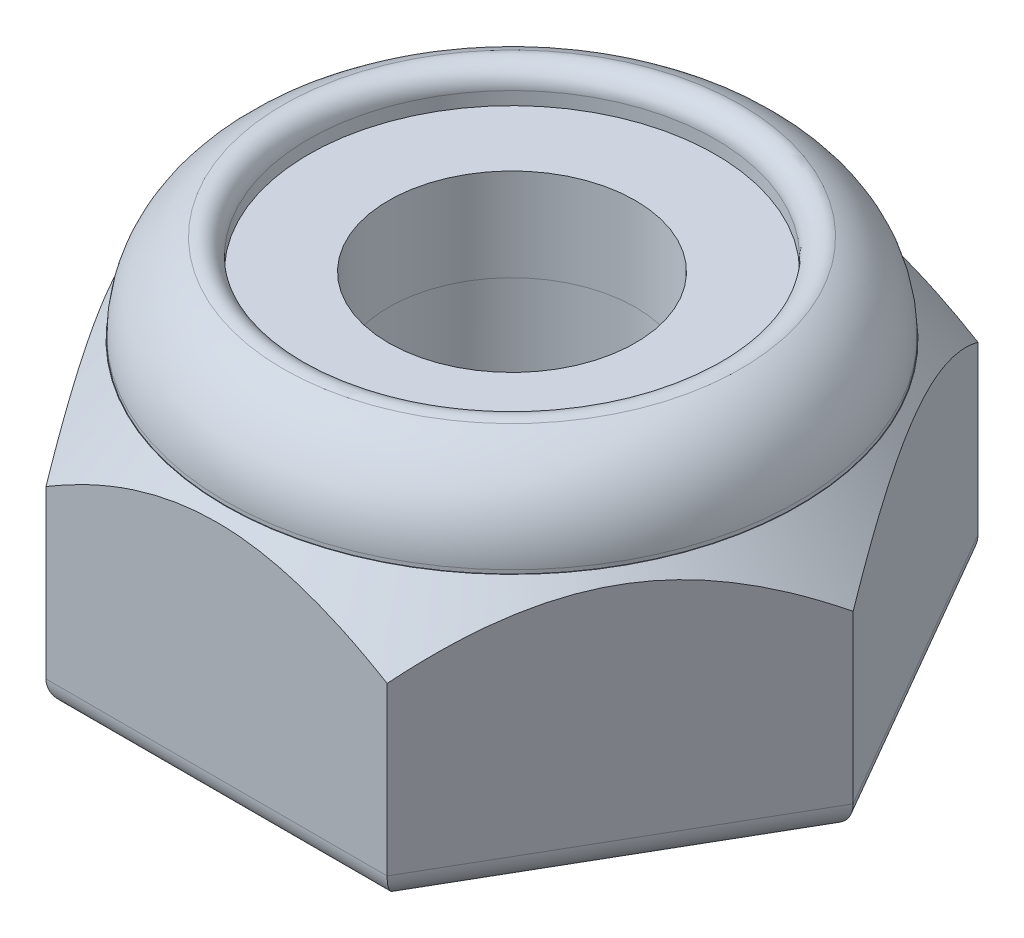
ISO-10303-21;
HEADER;
FILE_DESCRIPTION(('STEP AP214'),'2;1');
FILE_NAME('part.step','',(''),(''),'','','');
FILE_SCHEMA(('AUTOMOTIVE_DESIGN { 1 0 10303 214 1 1 1 1 }'));
ENDSEC;
DATA;
#1=APPLICATION_CONTEXT('core data for automotive mechanical design processes');
#2=APPLICATION_PROTOCOL_DEFINITION('international standard','automotive_design',2000,#1);
#3=PRODUCT_CONTEXT('',#1,'mechanical');
#4=PRODUCT('Part','Part','',(#3));
#5=PRODUCT_RELATED_PRODUCT_CATEGORY('part','',(#4));
#6=PRODUCT_DEFINITION_FORMATION('','',#4);
#7=PRODUCT_DEFINITION_CONTEXT('part definition',#1,'design');
#8=PRODUCT_DEFINITION('design','',#6,#7);
#9=PRODUCT_DEFINITION_SHAPE('','',#8);
#10=(LENGTH_UNIT() NAMED_UNIT(*) SI_UNIT(.MILLI.,.METRE.));
#11=(NAMED_UNIT(*) PLANE_ANGLE_UNIT() SI_UNIT($,.RADIAN.));
#12=(NAMED_UNIT(*) SI_UNIT($,.STERADIAN.) SOLID_ANGLE_UNIT());
#13=UNCERTAINTY_MEASURE_WITH_UNIT(LENGTH_MEASURE(1.E-05),#10,'distance_accuracy_value','');
#14=(GEOMETRIC_REPRESENTATION_CONTEXT(3) GLOBAL_UNCERTAINTY_ASSIGNED_CONTEXT((#13)) GLOBAL_UNIT_ASSIGNED_CONTEXT((#10,
#11,#12)) REPRESENTATION_CONTEXT('',''));
#15=CARTESIAN_POINT('',(0.,0.,0.));
#16=DIRECTION('',(0.,0.,1.));
#17=DIRECTION('',(1.,0.,0.));
#18=AXIS2_PLACEMENT_3D('',#15,#16,#17);
#19=CARTESIAN_POINT('',(0.,4.65025720786115,0.));
#20=DIRECTION('',(0.,-1.,0.));
#21=DIRECTION('',(0.,0.,-1.));
#22=AXIS2_PLACEMENT_3D('',#19,#20,#21);
#23=TOROIDAL_SURFACE('',#22,3.048,0.254);
#24=CARTESIAN_POINT('',(0.,4.65025720786115,0.));
#25=DIRECTION('',(0.,1.,0.));
#26=DIRECTION('',(0.,0.,-1.));
#27=AXIS2_PLACEMENT_3D('',#24,#25,#26);
#28=CIRCLE('',#27,2.794);
#29=CARTESIAN_POINT('',(0.,4.65025720786115,2.794));
#30=VERTEX_POINT('',#29);
#31=EDGE_CURVE('E23',#30,#30,#28,.T.);
#32=ORIENTED_EDGE('',*,*,#31,.F.);
#33=EDGE_LOOP('',(#32));
#34=FACE_BOUND('',#33,.T.);
#35=CARTESIAN_POINT('',(0.,4.88572150982643,0.));
#36=DIRECTION('',(0.,-1.,0.));
#37=DIRECTION('',(0.,0.,-1.));
#38=AXIS2_PLACEMENT_3D('',#35,#36,#37);
#39=CIRCLE('',#38,3.14325);
#40=CARTESIAN_POINT('',(0.,4.88572150982643,3.14325));
#41=VERTEX_POINT('',#40);
#42=EDGE_CURVE('E10',#41,#41,#39,.T.);
#43=ORIENTED_EDGE('',*,*,#42,.F.);
#44=EDGE_LOOP('',(#43));
#45=FACE_BOUND('',#44,.T.);
#46=ADVANCED_FACE('F16',(#34,#45),#23,.T.);
#47=CARTESIAN_POINT('',(0.,3.7084,0.));
#48=DIRECTION('',(0.,1.,0.));
#49=DIRECTION('',(0.,0.,1.));
#50=AXIS2_PLACEMENT_3D('',#47,#48,#49);
#51=TOROIDAL_SURFACE('',#50,2.667,1.27);
#52=CARTESIAN_POINT('',(0.,3.7084,0.));
#53=DIRECTION('',(0.,-1.,0.));
#54=DIRECTION('',(0.,0.,1.));
#55=AXIS2_PLACEMENT_3D('',#52,#53,#54);
#56=CIRCLE('',#55,3.937);
#57=CARTESIAN_POINT('',(0.,3.7084,-3.937));
#58=VERTEX_POINT('',#57);
#59=EDGE_CURVE('E267',#58,#58,#56,.T.);
#60=ORIENTED_EDGE('',*,*,#59,.F.);
#61=EDGE_LOOP('',(#60));
#62=FACE_BOUND('',#61,.T.);
#63=ORIENTED_EDGE('',*,*,#42,.T.);
#64=EDGE_LOOP('',(#63));
#65=FACE_BOUND('',#64,.T.);
#66=ADVANCED_FACE('F273',(#62,#65),#51,.T.);
#67=CARTESIAN_POINT('',(0.,4.4704,0.));
#68=DIRECTION('',(0.,-1.,0.));
#69=DIRECTION('',(0.,0.,1.));
#70=AXIS2_PLACEMENT_3D('',#67,#68,#69);
#71=CYLINDRICAL_SURFACE('',#70,2.794);
#72=ORIENTED_EDGE('',*,*,#31,.T.);
#73=EDGE_LOOP('',(#72));
#74=FACE_BOUND('',#73,.T.);
#75=CARTESIAN_POINT('',(0.,4.4704,0.));
#76=DIRECTION('',(0.,1.,0.));
#77=DIRECTION('',(0.,0.,1.));
#78=AXIS2_PLACEMENT_3D('',#75,#76,#77);
#79=CIRCLE('',#78,2.794);
#80=CARTESIAN_POINT('',(0.,4.4704,2.794));
#81=VERTEX_POINT('',#80);
#82=EDGE_CURVE('E183',#81,#81,#79,.T.);
#83=ORIENTED_EDGE('',*,*,#82,.F.);
#84=EDGE_LOOP('',(#83));
#85=FACE_BOUND('',#84,.T.);
#86=ADVANCED_FACE('F275',(#74,#85),#71,.F.);
#87=CARTESIAN_POINT('',(0.,4.9784,0.));
#88=DIRECTION('',(0.,1.,0.));
#89=DIRECTION('',(0.,0.,-1.));
#90=AXIS2_PLACEMENT_3D('',#87,#88,#89);
#91=CYLINDRICAL_SURFACE('',#90,3.937);
#92=ORIENTED_EDGE('',*,*,#59,.T.);
#93=EDGE_LOOP('',(#92));
#94=FACE_BOUND('',#93,.T.);
#95=CARTESIAN_POINT('',(0.,3.6576,0.));
#96=DIRECTION('',(0.,1.,0.));
#97=DIRECTION('',(0.,0.,-1.));
#98=AXIS2_PLACEMENT_3D('',#95,#96,#97);
#99=CIRCLE('',#98,3.937);
#100=CARTESIAN_POINT('',(0.,3.6576,-3.937));
#101=VERTEX_POINT('',#100);
#102=EDGE_CURVE('E181',#101,#101,#99,.T.);
#103=ORIENTED_EDGE('',*,*,#102,.T.);
#104=EDGE_LOOP('',(#103));
#105=FACE_BOUND('',#104,.T.);
#106=ADVANCED_FACE('F270',(#94,#105),#91,.T.);
#107=CARTESIAN_POINT('',(2.34315,3.6576,4.05845484975502));
#108=DIRECTION('',(-0.866025403784439,0.,-0.5));
#109=DIRECTION('',(-0.5,0.,0.866025403784439));
#110=AXIS2_PLACEMENT_3D('',#107,#108,#109);
#111=PLANE('',#110);
#112=DIRECTION('',(-0.5,0.,0.866025403784439));
#113=VECTOR('',#112,1.);
#114=CARTESIAN_POINT('',(2.9289375,0.4826,3.04384113731626));
#115=LINE('',#114,#113);
#116=CARTESIAN_POINT('',(4.6863,0.4826,0.));
#117=VERTEX_POINT('',#116);
#118=CARTESIAN_POINT('',(2.34315,0.4826,4.05845484975502));
#119=VERTEX_POINT('',#118);
#120=EDGE_CURVE('E150',#117,#119,#115,.T.);
#121=ORIENTED_EDGE('',*,*,#120,.F.);
#122=DIRECTION('',(0.,-1.,0.));
#123=VECTOR('',#122,1.);
#124=CARTESIAN_POINT('',(4.6863,0.508,0.));
#125=LINE('',#124,#123);
#126=CARTESIAN_POINT('',(4.6863,2.77304593389833,0.));
#127=VERTEX_POINT('',#126);
#128=EDGE_CURVE('E142',#127,#117,#125,.T.);
#129=ORIENTED_EDGE('',*,*,#128,.F.);
#130=CARTESIAN_POINT('',(6.62416236823912,-0.492,-3.35647607986592));
#131=CARTESIAN_POINT('',(3.514725,5.71462077953579,2.02922742487751));
#132=CARTESIAN_POINT('',(0.40528763176088,-0.492,7.41493092962093));
#133=(BOUNDED_CURVE() B_SPLINE_CURVE(2,(#130,#131,#132),.UNSPECIFIED.,.F.,
.F.) B_SPLINE_CURVE_WITH_KNOTS((3,3),(0.,1.4802816028728),
.UNSPECIFIED.) CURVE() GEOMETRIC_REPRESENTATION_ITEM() RATIONAL_B_SPLINE_CURVE((1.,
1.82976012148053,1.)) REPRESENTATION_ITEM(''));
#134=CARTESIAN_POINT('',(2.34315,2.77304593389833,4.05845484975502));
#135=VERTEX_POINT('',#134);
#136=EDGE_CURVE('E243',#127,#135,#133,.T.);
#137=ORIENTED_EDGE('',*,*,#136,.T.);
#138=DIRECTION('',(0.,-1.,0.));
#139=VECTOR('',#138,1.);
#140=CARTESIAN_POINT('',(2.34315,2.77304593389833,4.05845484975502));
#141=LINE('',#140,#139);
#142=EDGE_CURVE('E263',#135,#119,#141,.T.);
#143=ORIENTED_EDGE('',*,*,#142,.T.);
#144=EDGE_LOOP('',(#121,#129,#137,#143));
#145=FACE_BOUND('',#144,.T.);
#146=ADVANCED_FACE('F286',(#145),#111,.F.);
#147=CARTESIAN_POINT('',(0.,4.4704,0.));
#148=DIRECTION('',(0.,1.,0.));
#149=DIRECTION('',(0.,0.,1.));
#150=AXIS2_PLACEMENT_3D('',#147,#148,#149);
#151=PLANE('',#150);
#152=CARTESIAN_POINT('',(0.,4.4704,0.));
#153=DIRECTION('',(0.,-1.,0.));
#154=DIRECTION('',(0.,0.,1.));
#155=AXIS2_PLACEMENT_3D('',#152,#153,#154);
#156=CIRCLE('',#155,1.69545);
#157=CARTESIAN_POINT('',(0.,4.4704,1.69545));
#158=VERTEX_POINT('',#157);
#159=EDGE_CURVE('E227',#158,#158,#156,.T.);
#160=ORIENTED_EDGE('',*,*,#159,.T.);
#161=EDGE_LOOP('',(#160));
#162=FACE_BOUND('',#161,.T.);
#163=ORIENTED_EDGE('',*,*,#82,.T.);
#164=EDGE_LOOP('',(#163));
#165=FACE_BOUND('',#164,.T.);
#166=ADVANCED_FACE('F289',(#162,#165),#151,.T.);
#167=CARTESIAN_POINT('',(2.34315,3.6576,4.05845484975502));
#168=DIRECTION('',(0.,-1.,0.));
#169=DIRECTION('',(0.,0.,-1.));
#170=AXIS2_PLACEMENT_3D('',#167,#168,#169);
#171=PLANE('',#170);
#172=ORIENTED_EDGE('',*,*,#102,.F.);
#173=EDGE_LOOP('',(#172));
#174=FACE_BOUND('',#173,.T.);
#175=CARTESIAN_POINT('',(0.,3.6576,0.));
#176=DIRECTION('',(0.,1.,0.));
#177=DIRECTION('',(0.,0.,1.));
#178=AXIS2_PLACEMENT_3D('',#175,#176,#177);
#179=CIRCLE('',#178,3.94407100937772);
#180=CARTESIAN_POINT('',(0.,3.6576,-3.94407100937772));
#181=VERTEX_POINT('',#180);
#182=EDGE_CURVE('E258',#181,#181,#179,.T.);
#183=ORIENTED_EDGE('',*,*,#182,.T.);
#184=EDGE_LOOP('',(#183));
#185=FACE_BOUND('',#184,.T.);
#186=ADVANCED_FACE('F293',(#174,#185),#171,.F.);
#187=CARTESIAN_POINT('',(4.6863,3.6576,0.));
#188=DIRECTION('',(-0.866025403784439,0.,0.5));
#189=DIRECTION('',(0.5,0.,0.866025403784439));
#190=AXIS2_PLACEMENT_3D('',#187,#188,#189);
#191=PLANE('',#190);
#192=DIRECTION('',(0.5,0.,0.866025403784439));
#193=VECTOR('',#192,1.);
#194=CARTESIAN_POINT('',(4.1005125,0.4826,-1.01461371243876));
#195=LINE('',#194,#193);
#196=CARTESIAN_POINT('',(2.34315,0.4826,-4.05845484975502));
#197=VERTEX_POINT('',#196);
#198=EDGE_CURVE('E138',#197,#117,#195,.T.);
#199=ORIENTED_EDGE('',*,*,#198,.F.);
#200=DIRECTION('',(0.,-1.,0.));
#201=VECTOR('',#200,1.);
#202=CARTESIAN_POINT('',(2.34315,0.508,-4.05845484975502));
#203=LINE('',#202,#201);
#204=CARTESIAN_POINT('',(2.34315,2.77304593389832,-4.05845484975502));
#205=VERTEX_POINT('',#204);
#206=EDGE_CURVE('E115',#205,#197,#203,.T.);
#207=ORIENTED_EDGE('',*,*,#206,.F.);
#208=CARTESIAN_POINT('',(0.405287631760878,-0.492,-7.41493092962093));
#209=CARTESIAN_POINT('',(3.514725,5.7146207795358,-2.02922742487751));
#210=CARTESIAN_POINT('',(6.62416236823912,-0.492,3.35647607986592));
#211=(BOUNDED_CURVE() B_SPLINE_CURVE(2,(#208,#209,#210),.UNSPECIFIED.,.F.,
.F.) B_SPLINE_CURVE_WITH_KNOTS((3,3),(0.,1.4802816028728),
.UNSPECIFIED.) CURVE() GEOMETRIC_REPRESENTATION_ITEM() RATIONAL_B_SPLINE_CURVE((1.,
1.82976012148053,1.)) REPRESENTATION_ITEM(''));
#212=EDGE_CURVE('E251',#205,#127,#211,.T.);
#213=ORIENTED_EDGE('',*,*,#212,.T.);
#214=ORIENTED_EDGE('',*,*,#128,.T.);
#215=EDGE_LOOP('',(#199,#207,#213,#214));
#216=FACE_BOUND('',#215,.T.);
#217=ADVANCED_FACE('F141',(#216),#191,.F.);
#218=CARTESIAN_POINT('',(-2.34315,3.6576,4.05845484975502));
#219=DIRECTION('',(0.,0.,-1.));
#220=DIRECTION('',(-1.,0.,0.));
#221=AXIS2_PLACEMENT_3D('',#218,#219,#220);
#222=PLANE('',#221);
#223=DIRECTION('',(-1.,0.,0.));
#224=VECTOR('',#223,1.);
#225=CARTESIAN_POINT('',(-1.171575,0.4826,4.05845484975502));
#226=LINE('',#225,#224);
#227=CARTESIAN_POINT('',(-2.34315,0.4826,4.05845484975502));
#228=VERTEX_POINT('',#227);
#229=EDGE_CURVE('E172',#119,#228,#226,.T.);
#230=ORIENTED_EDGE('',*,*,#229,.F.);
#231=ORIENTED_EDGE('',*,*,#142,.F.);
#232=CARTESIAN_POINT('',(6.21887473647825,-0.492,4.05845484975502));
#233=CARTESIAN_POINT('',(0.,5.71462077953579,4.05845484975501));
#234=CARTESIAN_POINT('',(-6.21887473647825,-0.492,4.05845484975502));
#235=(BOUNDED_CURVE() B_SPLINE_CURVE(2,(#232,#233,#234),.UNSPECIFIED.,.F.,
.F.) B_SPLINE_CURVE_WITH_KNOTS((3,3),(-1.4802816028728,0.),
.UNSPECIFIED.) CURVE() GEOMETRIC_REPRESENTATION_ITEM() RATIONAL_B_SPLINE_CURVE((1.,
1.82976012148054,1.)) REPRESENTATION_ITEM(''));
#236=CARTESIAN_POINT('',(0.,3.52128264729563,4.05845484975502));
#237=VERTEX_POINT('',#236);
#238=EDGE_CURVE('E236',#135,#237,#235,.T.);
#239=ORIENTED_EDGE('',*,*,#238,.T.);
#240=CARTESIAN_POINT('',(6.21887473647825,-0.492,4.05845484975502));
#241=CARTESIAN_POINT('',(0.,5.71462077953579,4.05845484975501));
#242=CARTESIAN_POINT('',(-6.21887473647825,-0.492,4.05845484975502));
#243=(BOUNDED_CURVE() B_SPLINE_CURVE(2,(#240,#241,#242),.UNSPECIFIED.,.F.,
.F.) B_SPLINE_CURVE_WITH_KNOTS((3,3),(0.,1.4802816028728),
.UNSPECIFIED.) CURVE() GEOMETRIC_REPRESENTATION_ITEM() RATIONAL_B_SPLINE_CURVE((1.,
1.82976012148054,1.)) REPRESENTATION_ITEM(''));
#244=CARTESIAN_POINT('',(-2.34315,2.77304593389833,4.05845484975502));
#245=VERTEX_POINT('',#244);
#246=EDGE_CURVE('E232',#237,#245,#243,.T.);
#247=ORIENTED_EDGE('',*,*,#246,.T.);
#248=DIRECTION('',(0.,-1.,0.));
#249=VECTOR('',#248,1.);
#250=CARTESIAN_POINT('',(-2.34315,2.77304593389833,4.05845484975502));
#251=LINE('',#250,#249);
#252=EDGE_CURVE('E212',#245,#228,#251,.T.);
#253=ORIENTED_EDGE('',*,*,#252,.T.);
#254=EDGE_LOOP('',(#230,#231,#239,#247,#253));
#255=FACE_BOUND('',#254,.T.);
#256=ADVANCED_FACE('F308',(#255),#222,.F.);
#257=CARTESIAN_POINT('',(0.,0.,0.));
#258=DIRECTION('',(0.,-1.,0.));
#259=DIRECTION('',(0.,0.,1.));
#260=AXIS2_PLACEMENT_3D('',#257,#258,#259);
#261=CYLINDRICAL_SURFACE('',#260,1.69545);
#262=CARTESIAN_POINT('',(0.,3.2004,0.));
#263=DIRECTION('',(0.,1.,0.));
#264=DIRECTION('',(0.,0.,1.));
#265=AXIS2_PLACEMENT_3D('',#262,#263,#264);
#266=CIRCLE('',#265,1.69545);
#267=CARTESIAN_POINT('',(0.,3.2004,-1.69545));
#268=VERTEX_POINT('',#267);
#269=EDGE_CURVE('E229',#268,#268,#266,.T.);
#270=ORIENTED_EDGE('',*,*,#269,.T.);
#271=EDGE_LOOP('',(#270));
#272=FACE_BOUND('',#271,.T.);
#273=CARTESIAN_POINT('',(0.,0.1016,0.));
#274=DIRECTION('',(0.,1.,0.));
#275=DIRECTION('',(-1.,0.,0.));
#276=AXIS2_PLACEMENT_3D('',#273,#274,#275);
#277=CIRCLE('',#276,1.69545);
#278=CARTESIAN_POINT('',(1.69545,0.1016,0.));
#279=VERTEX_POINT('',#278);
#280=EDGE_CURVE('E221',#279,#279,#277,.T.);
#281=ORIENTED_EDGE('',*,*,#280,.F.);
#282=EDGE_LOOP('',(#281));
#283=FACE_BOUND('',#282,.T.);
#284=ADVANCED_FACE('F299',(#272,#283),#261,.F.);
#285=CARTESIAN_POINT('',(0.,-21.9125804570201,0.));
#286=DIRECTION('',(0.,-1.,0.));
#287=DIRECTION('',(0.,0.,-1.));
#288=AXIS2_PLACEMENT_3D('',#285,#286,#287);
#289=CONICAL_SURFACE('',#288,25.4,0.698131700797737);
#290=ORIENTED_EDGE('',*,*,#182,.F.);
#291=EDGE_LOOP('',(#290));
#292=FACE_BOUND('',#291,.T.);
#293=CARTESIAN_POINT('',(-6.21887473647825,-0.492,-4.05845484975502));
#294=CARTESIAN_POINT('',(0.,5.71462077953579,-4.05845484975502));
#295=CARTESIAN_POINT('',(6.21887473647825,-0.492,-4.05845484975502));
#296=(BOUNDED_CURVE() B_SPLINE_CURVE(2,(#293,#294,#295),.UNSPECIFIED.,.F.,
.F.) B_SPLINE_CURVE_WITH_KNOTS((3,3),(-1.4802816028728,0.),
.UNSPECIFIED.) CURVE() GEOMETRIC_REPRESENTATION_ITEM() RATIONAL_B_SPLINE_CURVE((1.,
1.82976012148053,1.)) REPRESENTATION_ITEM(''));
#297=CARTESIAN_POINT('',(-2.34315,2.77304593389832,-4.05845484975502));
#298=VERTEX_POINT('',#297);
#299=CARTESIAN_POINT('',(0.,3.52128264729563,-4.05845484975502));
#300=VERTEX_POINT('',#299);
#301=EDGE_CURVE('E194',#298,#300,#296,.T.);
#302=ORIENTED_EDGE('',*,*,#301,.F.);
#303=CARTESIAN_POINT('',(-6.62416236823913,-0.492,3.35647607986591));
#304=CARTESIAN_POINT('',(-3.51472500000001,5.71462077953579,-2.02922742487752));
#305=CARTESIAN_POINT('',(-0.405287631760878,-0.492,-7.41493092962093));
#306=(BOUNDED_CURVE() B_SPLINE_CURVE(2,(#303,#304,#305),.UNSPECIFIED.,.F.,
.F.) B_SPLINE_CURVE_WITH_KNOTS((3,3),(-1.4802816028728,0.),
.UNSPECIFIED.) CURVE() GEOMETRIC_REPRESENTATION_ITEM() RATIONAL_B_SPLINE_CURVE((1.,
1.82976012148053,1.)) REPRESENTATION_ITEM(''));
#307=CARTESIAN_POINT('',(-4.6863,2.77304593389832,0.));
#308=VERTEX_POINT('',#307);
#309=EDGE_CURVE('E208',#308,#298,#306,.T.);
#310=ORIENTED_EDGE('',*,*,#309,.F.);
#311=CARTESIAN_POINT('',(-0.405287631760876,-0.492,7.41493092962093));
#312=CARTESIAN_POINT('',(-3.514725,5.71462077953578,2.0292274248775));
#313=CARTESIAN_POINT('',(-6.62416236823913,-0.492,-3.35647607986591));
#314=(BOUNDED_CURVE() B_SPLINE_CURVE(2,(#311,#312,#313),.UNSPECIFIED.,.F.,
.F.) B_SPLINE_CURVE_WITH_KNOTS((3,3),(-1.4802816028728,0.),
.UNSPECIFIED.) CURVE() GEOMETRIC_REPRESENTATION_ITEM() RATIONAL_B_SPLINE_CURVE((1.,
1.82976012148054,1.)) REPRESENTATION_ITEM(''));
#315=EDGE_CURVE('E217',#245,#308,#314,.T.);
#316=ORIENTED_EDGE('',*,*,#315,.F.);
#317=ORIENTED_EDGE('',*,*,#246,.F.);
#318=ORIENTED_EDGE('',*,*,#238,.F.);
#319=ORIENTED_EDGE('',*,*,#136,.F.);
#320=ORIENTED_EDGE('',*,*,#212,.F.);
#321=CARTESIAN_POINT('',(-6.21887473647825,-0.492,-4.05845484975502));
#322=CARTESIAN_POINT('',(0.,5.71462077953579,-4.05845484975502));
#323=CARTESIAN_POINT('',(6.21887473647825,-0.492,-4.05845484975502));
#324=(BOUNDED_CURVE() B_SPLINE_CURVE(2,(#321,#322,#323),.UNSPECIFIED.,.F.,
.F.) B_SPLINE_CURVE_WITH_KNOTS((3,3),(-1.4802816028728,0.),
.UNSPECIFIED.) CURVE() GEOMETRIC_REPRESENTATION_ITEM() RATIONAL_B_SPLINE_CURVE((1.,
1.82976012148053,1.)) REPRESENTATION_ITEM(''));
#325=EDGE_CURVE('E121',#300,#205,#324,.T.);
#326=ORIENTED_EDGE('',*,*,#325,.F.);
#327=EDGE_LOOP('',(#302,#310,#316,#317,#318,#319,#320,#326));
#328=FACE_BOUND('',#327,.T.);
#329=ADVANCED_FACE('F295',(#292,#328),#289,.T.);
#330=CARTESIAN_POINT('',(0.,0.,0.));
#331=DIRECTION('',(0.,-1.,0.));
#332=DIRECTION('',(0.,0.,1.));
#333=AXIS2_PLACEMENT_3D('',#330,#331,#332);
#334=CYLINDRICAL_SURFACE('',#333,1.69545);
#335=ORIENTED_EDGE('',*,*,#269,.F.);
#336=EDGE_LOOP('',(#335));
#337=FACE_BOUND('',#336,.T.);
#338=ORIENTED_EDGE('',*,*,#159,.F.);
#339=EDGE_LOOP('',(#338));
#340=FACE_BOUND('',#339,.T.);
#341=ADVANCED_FACE('F298',(#337,#340),#334,.F.);
#342=CARTESIAN_POINT('',(0.,0.1016,0.));
#343=DIRECTION('',(0.,-1.,0.));
#344=DIRECTION('',(0.,0.,-1.));
#345=AXIS2_PLACEMENT_3D('',#342,#343,#344);
#346=PLANE('',#345);
#347=DIRECTION('',(0.5,0.,0.866025403784439));
#348=VECTOR('',#347,1.);
#349=CARTESIAN_POINT('',(-3.77055682115813,0.1016,0.824113712438751));
#350=LINE('',#349,#348);
#351=CARTESIAN_POINT('',(-4.24635909487751,0.1016,0.));
#352=VERTEX_POINT('',#351);
#353=CARTESIAN_POINT('',(-2.12317954743876,0.1016,3.67745484975501));
#354=VERTEX_POINT('',#353);
#355=EDGE_CURVE('E153',#352,#354,#350,.T.);
#356=ORIENTED_EDGE('',*,*,#355,.F.);
#357=DIRECTION('',(-0.5,0.,0.866025403784439));
#358=VECTOR('',#357,1.);
#359=CARTESIAN_POINT('',(-2.59898182115813,0.1016,-2.85334113731627));
#360=LINE('',#359,#358);
#361=CARTESIAN_POINT('',(-2.12317954743876,0.1016,-3.67745484975502));
#362=VERTEX_POINT('',#361);
#363=EDGE_CURVE('E190',#362,#352,#360,.T.);
#364=ORIENTED_EDGE('',*,*,#363,.F.);
#365=DIRECTION('',(-1.,0.,0.));
#366=VECTOR('',#365,1.);
#367=CARTESIAN_POINT('',(1.171575,0.1016,-3.67745484975502));
#368=LINE('',#367,#366);
#369=CARTESIAN_POINT('',(2.12317954743876,0.1016,-3.67745484975502));
#370=VERTEX_POINT('',#369);
#371=EDGE_CURVE('E137',#370,#362,#368,.T.);
#372=ORIENTED_EDGE('',*,*,#371,.F.);
#373=DIRECTION('',(-0.5,0.,-0.866025403784439));
#374=VECTOR('',#373,1.);
#375=CARTESIAN_POINT('',(3.77055682115813,0.1016,-0.824113712438757));
#376=LINE('',#375,#374);
#377=CARTESIAN_POINT('',(4.2463590948775,0.1016,0.));
#378=VERTEX_POINT('',#377);
#379=EDGE_CURVE('E148',#378,#370,#376,.T.);
#380=ORIENTED_EDGE('',*,*,#379,.F.);
#381=DIRECTION('',(0.5,0.,-0.866025403784439));
#382=VECTOR('',#381,1.);
#383=CARTESIAN_POINT('',(2.59898182115813,0.1016,2.85334113731626));
#384=LINE('',#383,#382);
#385=CARTESIAN_POINT('',(2.12317954743876,0.1016,3.67745484975501));
#386=VERTEX_POINT('',#385);
#387=EDGE_CURVE('E175',#386,#378,#384,.T.);
#388=ORIENTED_EDGE('',*,*,#387,.F.);
#389=DIRECTION('',(1.,0.,0.));
#390=VECTOR('',#389,1.);
#391=CARTESIAN_POINT('',(-1.171575,0.1016,3.67745484975501));
#392=LINE('',#391,#390);
#393=EDGE_CURVE('E166',#354,#386,#392,.T.);
#394=ORIENTED_EDGE('',*,*,#393,.F.);
#395=EDGE_LOOP('',(#356,#364,#372,#380,#388,#394));
#396=FACE_BOUND('',#395,.T.);
#397=ORIENTED_EDGE('',*,*,#280,.T.);
#398=EDGE_LOOP('',(#397));
#399=FACE_BOUND('',#398,.T.);
#400=ADVANCED_FACE('F301',(#396,#399),#346,.T.);
#401=CARTESIAN_POINT('',(-4.6863,3.6576,0.));
#402=DIRECTION('',(0.866025403784439,0.,-0.5));
#403=DIRECTION('',(-0.5,0.,-0.866025403784439));
#404=AXIS2_PLACEMENT_3D('',#401,#402,#403);
#405=PLANE('',#404);
#406=DIRECTION('',(-0.5,0.,-0.866025403784439));
#407=VECTOR('',#406,1.);
#408=CARTESIAN_POINT('',(-4.10051250000001,0.4826,1.01461371243875));
#409=LINE('',#408,#407);
#410=CARTESIAN_POINT('',(-4.6863,0.4826,0.));
#411=VERTEX_POINT('',#410);
#412=EDGE_CURVE('E158',#228,#411,#409,.T.);
#413=ORIENTED_EDGE('',*,*,#412,.F.);
#414=ORIENTED_EDGE('',*,*,#252,.F.);
#415=ORIENTED_EDGE('',*,*,#315,.T.);
#416=DIRECTION('',(0.,-1.,0.));
#417=VECTOR('',#416,1.);
#418=CARTESIAN_POINT('',(-4.6863,2.77304593389832,0.));
#419=LINE('',#418,#417);
#420=EDGE_CURVE('E125',#308,#411,#419,.T.);
#421=ORIENTED_EDGE('',*,*,#420,.T.);
#422=EDGE_LOOP('',(#413,#414,#415,#421));
#423=FACE_BOUND('',#422,.T.);
#424=ADVANCED_FACE('F304',(#423),#405,.F.);
#425=CARTESIAN_POINT('',(-2.34315,3.6576,-4.05845484975502));
#426=DIRECTION('',(0.866025403784439,0.,0.5));
#427=DIRECTION('',(0.5,0.,-0.866025403784439));
#428=AXIS2_PLACEMENT_3D('',#425,#426,#427);
#429=PLANE('',#428);
#430=DIRECTION('',(0.5,0.,-0.866025403784439));
#431=VECTOR('',#430,1.);
#432=CARTESIAN_POINT('',(-2.92893750000001,0.4826,-3.04384113731627));
#433=LINE('',#432,#431);
#434=CARTESIAN_POINT('',(-2.34315,0.4826,-4.05845484975502));
#435=VERTEX_POINT('',#434);
#436=EDGE_CURVE('E187',#411,#435,#433,.T.);
#437=ORIENTED_EDGE('',*,*,#436,.F.);
#438=ORIENTED_EDGE('',*,*,#420,.F.);
#439=ORIENTED_EDGE('',*,*,#309,.T.);
#440=DIRECTION('',(0.,-1.,0.));
#441=VECTOR('',#440,1.);
#442=CARTESIAN_POINT('',(-2.34315,0.508,-4.05845484975502));
#443=LINE('',#442,#441);
#444=EDGE_CURVE('E192',#298,#435,#443,.T.);
#445=ORIENTED_EDGE('',*,*,#444,.T.);
#446=EDGE_LOOP('',(#437,#438,#439,#445));
#447=FACE_BOUND('',#446,.T.);
#448=ADVANCED_FACE('F311',(#447),#429,.F.);
#449=CARTESIAN_POINT('',(2.34315,3.6576,-4.05845484975502));
#450=DIRECTION('',(0.,0.,1.));
#451=DIRECTION('',(1.,0.,0.));
#452=AXIS2_PLACEMENT_3D('',#449,#450,#451);
#453=PLANE('',#452);
#454=DIRECTION('',(1.,0.,0.));
#455=VECTOR('',#454,1.);
#456=CARTESIAN_POINT('',(1.171575,0.4826,-4.05845484975502));
#457=LINE('',#456,#455);
#458=EDGE_CURVE('E119',#435,#197,#457,.T.);
#459=ORIENTED_EDGE('',*,*,#458,.F.);
#460=ORIENTED_EDGE('',*,*,#444,.F.);
#461=ORIENTED_EDGE('',*,*,#301,.T.);
#462=ORIENTED_EDGE('',*,*,#325,.T.);
#463=ORIENTED_EDGE('',*,*,#206,.T.);
#464=EDGE_LOOP('',(#459,#460,#461,#462,#463));
#465=FACE_BOUND('',#464,.T.);
#466=ADVANCED_FACE('F117',(#465),#453,.F.);
#467=CARTESIAN_POINT('',(-2.59898182115813,0.4826,-2.85334113731627));
#468=DIRECTION('',(-0.5,0.,0.866025403784439));
#469=DIRECTION('',(-0.612372435695795,-0.707106781186547,-0.353553390593274));
#470=AXIS2_PLACEMENT_3D('',#467,#468,#469);
#471=CYLINDRICAL_SURFACE('',#470,0.381);
#472=ORIENTED_EDGE('',*,*,#436,.T.);
#473=CARTESIAN_POINT('',(-2.12317954743876,0.4826,-3.67745484975502));
#474=DIRECTION('',(0.866025403784439,0.,-0.5));
#475=DIRECTION('',(-0.5,0.,-0.866025403784439));
#476=AXIS2_PLACEMENT_3D('',#473,#474,#475);
#477=ELLIPSE('',#476,0.439940905122495,0.381);
#478=EDGE_CURVE('E136',#362,#435,#477,.T.);
#479=ORIENTED_EDGE('',*,*,#478,.F.);
#480=ORIENTED_EDGE('',*,*,#363,.T.);
#481=CARTESIAN_POINT('',(-4.24635909487751,0.4826,0.));
#482=DIRECTION('',(0.,0.,-1.));
#483=DIRECTION('',(-1.,0.,0.));
#484=AXIS2_PLACEMENT_3D('',#481,#482,#483);
#485=ELLIPSE('',#484,0.439940905122495,0.381);
#486=EDGE_CURVE('E162',#352,#411,#485,.T.);
#487=ORIENTED_EDGE('',*,*,#486,.T.);
#488=EDGE_LOOP('',(#472,#479,#480,#487));
#489=FACE_BOUND('',#488,.T.);
#490=ADVANCED_FACE('F318',(#489),#471,.T.);
#491=CARTESIAN_POINT('',(1.171575,0.4826,-3.67745484975502));
#492=DIRECTION('',(-1.,0.,0.));
#493=DIRECTION('',(0.,-0.707106781186547,-0.707106781186548));
#494=AXIS2_PLACEMENT_3D('',#491,#492,#493);
#495=CYLINDRICAL_SURFACE('',#494,0.381);
#496=ORIENTED_EDGE('',*,*,#458,.T.);
#497=CARTESIAN_POINT('',(2.12317954743876,0.4826,-3.67745484975502));
#498=DIRECTION('',(0.866025403784439,0.,0.5));
#499=DIRECTION('',(0.5,0.,-0.866025403784439));
#500=AXIS2_PLACEMENT_3D('',#497,#498,#499);
#501=ELLIPSE('',#500,0.439940905122496,0.381);
#502=EDGE_CURVE('E133',#370,#197,#501,.T.);
#503=ORIENTED_EDGE('',*,*,#502,.F.);
#504=ORIENTED_EDGE('',*,*,#371,.T.);
#505=ORIENTED_EDGE('',*,*,#478,.T.);
#506=EDGE_LOOP('',(#496,#503,#504,#505));
#507=FACE_BOUND('',#506,.T.);
#508=ADVANCED_FACE('F130',(#507),#495,.T.);
#509=CARTESIAN_POINT('',(3.77055682115813,0.4826,-0.824113712438757));
#510=DIRECTION('',(-0.5,0.,-0.866025403784439));
#511=DIRECTION('',(0.612372435695795,-0.707106781186548,-0.353553390593274));
#512=AXIS2_PLACEMENT_3D('',#509,#510,#511);
#513=CYLINDRICAL_SURFACE('',#512,0.381);
#514=ORIENTED_EDGE('',*,*,#379,.T.);
#515=ORIENTED_EDGE('',*,*,#502,.T.);
#516=ORIENTED_EDGE('',*,*,#198,.T.);
#517=CARTESIAN_POINT('',(4.2463590948775,0.4826,0.));
#518=DIRECTION('',(0.,0.,1.));
#519=DIRECTION('',(1.,0.,0.));
#520=AXIS2_PLACEMENT_3D('',#517,#518,#519);
#521=ELLIPSE('',#520,0.439940905122495,0.381);
#522=EDGE_CURVE('E178',#378,#117,#521,.T.);
#523=ORIENTED_EDGE('',*,*,#522,.F.);
#524=EDGE_LOOP('',(#514,#515,#516,#523));
#525=FACE_BOUND('',#524,.T.);
#526=ADVANCED_FACE('F147',(#525),#513,.T.);
#527=CARTESIAN_POINT('',(2.59898182115813,0.4826,2.85334113731626));
#528=DIRECTION('',(0.5,0.,-0.866025403784439));
#529=DIRECTION('',(0.612372435695795,-0.707106781186548,0.353553390593274));
#530=AXIS2_PLACEMENT_3D('',#527,#528,#529);
#531=CYLINDRICAL_SURFACE('',#530,0.381);
#532=ORIENTED_EDGE('',*,*,#387,.T.);
#533=ORIENTED_EDGE('',*,*,#522,.T.);
#534=ORIENTED_EDGE('',*,*,#120,.T.);
#535=CARTESIAN_POINT('',(2.12317954743876,0.4826,3.67745484975501));
#536=DIRECTION('',(-0.866025403784443,0.,0.499999999999992));
#537=DIRECTION('',(0.499999999999992,0.,0.866025403784443));
#538=AXIS2_PLACEMENT_3D('',#535,#536,#537);
#539=ELLIPSE('',#538,0.439940905122493,0.381);
#540=EDGE_CURVE('E169',#386,#119,#539,.T.);
#541=ORIENTED_EDGE('',*,*,#540,.F.);
#542=EDGE_LOOP('',(#532,#533,#534,#541));
#543=FACE_BOUND('',#542,.T.);
#544=ADVANCED_FACE('F332',(#543),#531,.T.);
#545=CARTESIAN_POINT('',(-1.171575,0.4826,3.67745484975501));
#546=DIRECTION('',(1.,0.,0.));
#547=DIRECTION('',(0.,-0.707106781186547,0.707106781186548));
#548=AXIS2_PLACEMENT_3D('',#545,#546,#547);
#549=CYLINDRICAL_SURFACE('',#548,0.381);
#550=ORIENTED_EDGE('',*,*,#393,.T.);
#551=ORIENTED_EDGE('',*,*,#540,.T.);
#552=ORIENTED_EDGE('',*,*,#229,.T.);
#553=CARTESIAN_POINT('',(-2.12317954743876,0.4826,3.67745484975501));
#554=DIRECTION('',(-0.866025403784439,0.,-0.5));
#555=DIRECTION('',(-0.5,0.,0.866025403784439));
#556=AXIS2_PLACEMENT_3D('',#553,#554,#555);
#557=ELLIPSE('',#556,0.439940905122495,0.381);
#558=EDGE_CURVE('E156',#354,#228,#557,.T.);
#559=ORIENTED_EDGE('',*,*,#558,.F.);
#560=EDGE_LOOP('',(#550,#551,#552,#559));
#561=FACE_BOUND('',#560,.T.);
#562=ADVANCED_FACE('F338',(#561),#549,.T.);
#563=CARTESIAN_POINT('',(-3.77055682115813,0.4826,0.824113712438751));
#564=DIRECTION('',(0.5,0.,0.866025403784439));
#565=DIRECTION('',(-0.612372435695795,-0.707106781186548,0.353553390593274));
#566=AXIS2_PLACEMENT_3D('',#563,#564,#565);
#567=CYLINDRICAL_SURFACE('',#566,0.381);
#568=ORIENTED_EDGE('',*,*,#355,.T.);
#569=ORIENTED_EDGE('',*,*,#558,.T.);
#570=ORIENTED_EDGE('',*,*,#412,.T.);
#571=ORIENTED_EDGE('',*,*,#486,.F.);
#572=EDGE_LOOP('',(#568,#569,#570,#571));
#573=FACE_BOUND('',#572,.T.);
#574=ADVANCED_FACE('F345',(#573),#567,.T.);
#575=CLOSED_SHELL('',(#46,#66,#86,#106,#146,#166,#186,#217,#256,#284,#329,#341,#400,#424,#448,
#466,#490,#508,#526,#544,#562,#574));
#576=MANIFOLD_SOLID_BREP('B1',#575);
#577=ADVANCED_BREP_SHAPE_REPRESENTATION('',(#18,#576),#14);
#578=SHAPE_DEFINITION_REPRESENTATION(#9,#577);
ENDSEC;
END-ISO-10303-21;
